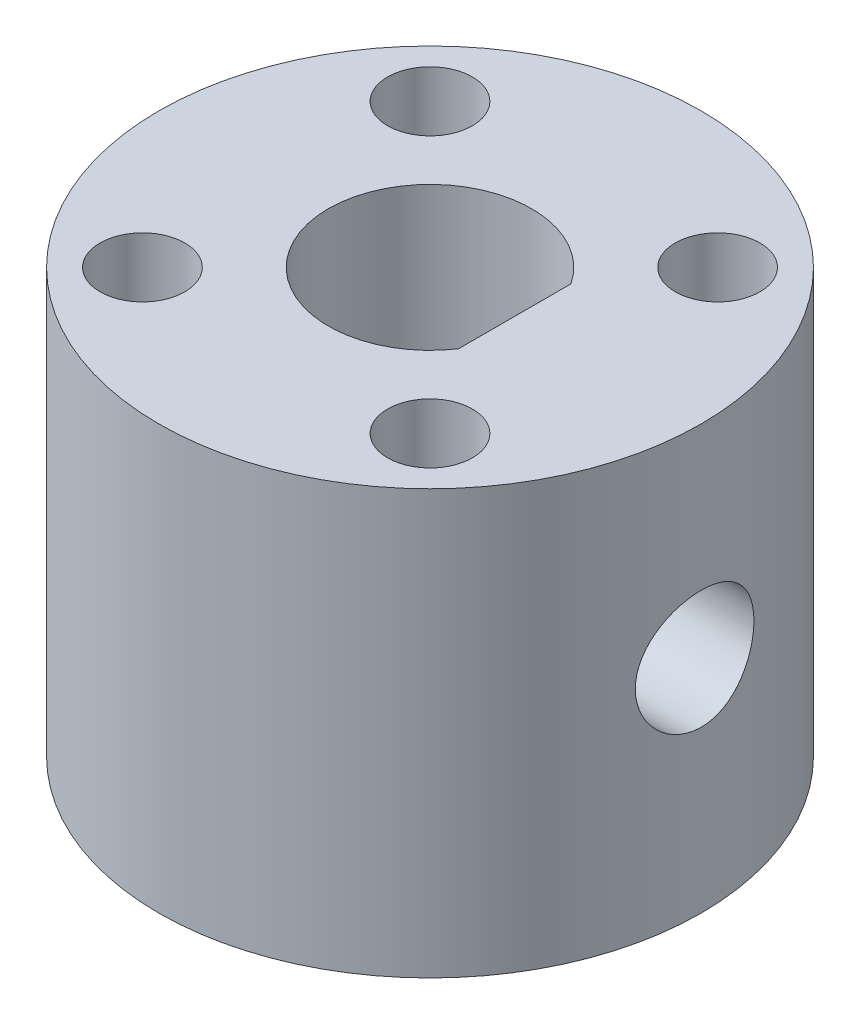
ISO-10303-21;
HEADER;
FILE_DESCRIPTION(('STEP AP214'),'2;1');
FILE_NAME('part.step','',(''),(''),'','','');
FILE_SCHEMA(('AUTOMOTIVE_DESIGN { 1 0 10303 214 1 1 1 1 }'));
ENDSEC;
DATA;
#1=APPLICATION_CONTEXT('core data for automotive mechanical design processes');
#2=APPLICATION_PROTOCOL_DEFINITION('international standard','automotive_design',2000,#1);
#3=PRODUCT_CONTEXT('',#1,'mechanical');
#4=PRODUCT('Part','Part','',(#3));
#5=PRODUCT_RELATED_PRODUCT_CATEGORY('part','',(#4));
#6=PRODUCT_DEFINITION_FORMATION('','',#4);
#7=PRODUCT_DEFINITION_CONTEXT('part definition',#1,'design');
#8=PRODUCT_DEFINITION('design','',#6,#7);
#9=PRODUCT_DEFINITION_SHAPE('','',#8);
#10=(LENGTH_UNIT() NAMED_UNIT(*) SI_UNIT(.MILLI.,.METRE.));
#11=(NAMED_UNIT(*) PLANE_ANGLE_UNIT() SI_UNIT($,.RADIAN.));
#12=(NAMED_UNIT(*) SI_UNIT($,.STERADIAN.) SOLID_ANGLE_UNIT());
#13=UNCERTAINTY_MEASURE_WITH_UNIT(LENGTH_MEASURE(1.E-05),#10,'distance_accuracy_value','');
#14=(GEOMETRIC_REPRESENTATION_CONTEXT(3) GLOBAL_UNCERTAINTY_ASSIGNED_CONTEXT((#13)) GLOBAL_UNIT_ASSIGNED_CONTEXT((#10,
#11,#12)) REPRESENTATION_CONTEXT('',''));
#15=CARTESIAN_POINT('',(0.,0.,0.));
#16=DIRECTION('',(0.,0.,1.));
#17=DIRECTION('',(1.,0.,0.));
#18=AXIS2_PLACEMENT_3D('',#15,#16,#17);
#19=CARTESIAN_POINT('',(2.5,12.5,-1.6583123951777));
#20=DIRECTION('',(-1.,0.,0.));
#21=DIRECTION('',(0.,0.,1.));
#22=AXIS2_PLACEMENT_3D('',#19,#20,#21);
#23=PLANE('',#22);
#24=CARTESIAN_POINT('',(2.5,6.5,0.));
#25=DIRECTION('',(-1.,0.,0.));
#26=DIRECTION('',(0.,0.,1.));
#27=AXIS2_PLACEMENT_3D('',#24,#25,#26);
#28=CIRCLE('',#27,1.75);
#29=CARTESIAN_POINT('',(2.5,7.05901699437495,1.6583123951777));
#30=VERTEX_POINT('',#29);
#31=CARTESIAN_POINT('',(2.5,7.05901699437495,-1.6583123951777));
#32=VERTEX_POINT('',#31);
#33=EDGE_CURVE('E99',#30,#32,#28,.T.);
#34=ORIENTED_EDGE('',*,*,#33,.F.);
#35=DIRECTION('',(0.,-1.,0.));
#36=VECTOR('',#35,1.);
#37=CARTESIAN_POINT('',(2.5,12.5,1.6583123951777));
#38=LINE('',#37,#36);
#39=CARTESIAN_POINT('',(2.5,12.5,1.6583123951777));
#40=VERTEX_POINT('',#39);
#41=EDGE_CURVE('E71',#40,#30,#38,.T.);
#42=ORIENTED_EDGE('',*,*,#41,.F.);
#43=DIRECTION('',(0.,0.,-1.));
#44=VECTOR('',#43,1.);
#45=CARTESIAN_POINT('',(2.5,12.5,-1.6583123951777));
#46=LINE('',#45,#44);
#47=CARTESIAN_POINT('',(2.5,12.5,-1.6583123951777));
#48=VERTEX_POINT('',#47);
#49=EDGE_CURVE('E123',#40,#48,#46,.T.);
#50=ORIENTED_EDGE('',*,*,#49,.T.);
#51=DIRECTION('',(0.,-1.,0.));
#52=VECTOR('',#51,1.);
#53=CARTESIAN_POINT('',(2.5,12.5,-1.6583123951777));
#54=LINE('',#53,#52);
#55=EDGE_CURVE('E106',#48,#32,#54,.T.);
#56=ORIENTED_EDGE('',*,*,#55,.T.);
#57=EDGE_LOOP('',(#34,#42,#50,#56));
#58=FACE_BOUND('',#57,.T.);
#59=ADVANCED_FACE('F48',(#58),#23,.T.);
#60=CARTESIAN_POINT('',(0.,12.5,0.));
#61=DIRECTION('',(0.,1.,0.));
#62=DIRECTION('',(0.,0.,1.));
#63=AXIS2_PLACEMENT_3D('',#60,#61,#62);
#64=PLANE('',#63);
#65=CARTESIAN_POINT('',(-4.24264068711904,12.5,4.24264068711953));
#66=DIRECTION('',(0.,1.,0.));
#67=DIRECTION('',(0.,0.,1.));
#68=AXIS2_PLACEMENT_3D('',#65,#66,#67);
#69=CIRCLE('',#68,1.25000000000018);
#70=CARTESIAN_POINT('',(-4.24264068711904,12.5,5.49264068711971));
#71=VERTEX_POINT('',#70);
#72=EDGE_CURVE('E133',#71,#71,#69,.T.);
#73=ORIENTED_EDGE('',*,*,#72,.F.);
#74=EDGE_LOOP('',(#73));
#75=FACE_BOUND('',#74,.T.);
#76=CARTESIAN_POINT('',(4.24264068711928,12.5,-4.24264068711929));
#77=DIRECTION('',(0.,1.,0.));
#78=DIRECTION('',(0.,0.,1.));
#79=AXIS2_PLACEMENT_3D('',#76,#77,#78);
#80=CIRCLE('',#79,1.25);
#81=CARTESIAN_POINT('',(4.24264068711928,12.5,-2.99264068711929));
#82=VERTEX_POINT('',#81);
#83=EDGE_CURVE('E283',#82,#82,#80,.T.);
#84=ORIENTED_EDGE('',*,*,#83,.F.);
#85=EDGE_LOOP('',(#84));
#86=FACE_BOUND('',#85,.T.);
#87=CARTESIAN_POINT('',(0.,12.5,0.));
#88=DIRECTION('',(0.,1.,0.));
#89=DIRECTION('',(0.,0.,1.));
#90=AXIS2_PLACEMENT_3D('',#87,#88,#89);
#91=CIRCLE('',#90,8.);
#92=CARTESIAN_POINT('',(0.,12.5,8.));
#93=VERTEX_POINT('',#92);
#94=EDGE_CURVE('E57',#93,#93,#91,.T.);
#95=ORIENTED_EDGE('',*,*,#94,.T.);
#96=EDGE_LOOP('',(#95));
#97=FACE_BOUND('',#96,.T.);
#98=CARTESIAN_POINT('',(4.24264068711953,12.5,4.24264068711928));
#99=DIRECTION('',(0.,1.,0.));
#100=DIRECTION('',(0.,0.,1.));
#101=AXIS2_PLACEMENT_3D('',#98,#99,#100);
#102=CIRCLE('',#101,1.24999999999994);
#103=CARTESIAN_POINT('',(4.24264068711953,12.5,5.49264068711922));
#104=VERTEX_POINT('',#103);
#105=EDGE_CURVE('E115',#104,#104,#102,.T.);
#106=ORIENTED_EDGE('',*,*,#105,.F.);
#107=EDGE_LOOP('',(#106));
#108=FACE_BOUND('',#107,.T.);
#109=ORIENTED_EDGE('',*,*,#49,.F.);
#110=CARTESIAN_POINT('',(0.,12.5,0.));
#111=DIRECTION('',(0.,1.,0.));
#112=DIRECTION('',(0.,0.,1.));
#113=AXIS2_PLACEMENT_3D('',#110,#111,#112);
#114=CIRCLE('',#113,3.);
#115=EDGE_CURVE('E111',#48,#40,#114,.T.);
#116=ORIENTED_EDGE('',*,*,#115,.F.);
#117=EDGE_LOOP('',(#109,#116));
#118=FACE_BOUND('',#117,.T.);
#119=CARTESIAN_POINT('',(-4.24264068711929,12.5,-4.24264068711904));
#120=DIRECTION('',(0.,1.,0.));
#121=DIRECTION('',(0.,0.,1.));
#122=AXIS2_PLACEMENT_3D('',#119,#120,#121);
#123=CIRCLE('',#122,1.25000000000026);
#124=CARTESIAN_POINT('',(-4.24264068711929,12.5,-2.99264068711878));
#125=VERTEX_POINT('',#124);
#126=EDGE_CURVE('E149',#125,#125,#123,.T.);
#127=ORIENTED_EDGE('',*,*,#126,.F.);
#128=EDGE_LOOP('',(#127));
#129=FACE_BOUND('',#128,.T.);
#130=ADVANCED_FACE('F175',(#75,#86,#97,#108,#118,#129),#64,.T.);
#131=CARTESIAN_POINT('',(0.,0.,0.));
#132=DIRECTION('',(0.,1.,0.));
#133=DIRECTION('',(0.,0.,1.));
#134=AXIS2_PLACEMENT_3D('',#131,#132,#133);
#135=PLANE('',#134);
#136=CARTESIAN_POINT('',(4.24264068711953,0.,4.24264068711928));
#137=DIRECTION('',(0.,1.,0.));
#138=DIRECTION('',(0.,0.,1.));
#139=AXIS2_PLACEMENT_3D('',#136,#137,#138);
#140=CIRCLE('',#139,1.24999999999994);
#141=CARTESIAN_POINT('',(4.24264068711953,0.,5.49264068711922));
#142=VERTEX_POINT('',#141);
#143=EDGE_CURVE('E113',#142,#142,#140,.T.);
#144=ORIENTED_EDGE('',*,*,#143,.T.);
#145=EDGE_LOOP('',(#144));
#146=FACE_BOUND('',#145,.T.);
#147=CARTESIAN_POINT('',(4.24264068711928,0.,-4.24264068711929));
#148=DIRECTION('',(0.,1.,0.));
#149=DIRECTION('',(0.,0.,1.));
#150=AXIS2_PLACEMENT_3D('',#147,#148,#149);
#151=CIRCLE('',#150,1.25);
#152=CARTESIAN_POINT('',(4.24264068711928,0.,-2.99264068711929));
#153=VERTEX_POINT('',#152);
#154=EDGE_CURVE('E278',#153,#153,#151,.T.);
#155=ORIENTED_EDGE('',*,*,#154,.T.);
#156=EDGE_LOOP('',(#155));
#157=FACE_BOUND('',#156,.T.);
#158=CARTESIAN_POINT('',(0.,0.,0.));
#159=DIRECTION('',(0.,1.,0.));
#160=DIRECTION('',(0.,0.,1.));
#161=AXIS2_PLACEMENT_3D('',#158,#159,#160);
#162=CIRCLE('',#161,8.);
#163=CARTESIAN_POINT('',(0.,0.,8.));
#164=VERTEX_POINT('',#163);
#165=EDGE_CURVE('E281',#164,#164,#162,.T.);
#166=ORIENTED_EDGE('',*,*,#165,.F.);
#167=EDGE_LOOP('',(#166));
#168=FACE_BOUND('',#167,.T.);
#169=CARTESIAN_POINT('',(0.,0.,0.));
#170=DIRECTION('',(0.,1.,0.));
#171=DIRECTION('',(0.,0.,1.));
#172=AXIS2_PLACEMENT_3D('',#169,#170,#171);
#173=CIRCLE('',#172,3.);
#174=CARTESIAN_POINT('',(2.5,0.,-1.6583123951777));
#175=VERTEX_POINT('',#174);
#176=CARTESIAN_POINT('',(2.5,0.,1.6583123951777));
#177=VERTEX_POINT('',#176);
#178=EDGE_CURVE('E131',#175,#177,#173,.T.);
#179=ORIENTED_EDGE('',*,*,#178,.T.);
#180=DIRECTION('',(0.,0.,-1.));
#181=VECTOR('',#180,1.);
#182=CARTESIAN_POINT('',(2.5,0.,-1.6583123951777));
#183=LINE('',#182,#181);
#184=EDGE_CURVE('E127',#177,#175,#183,.T.);
#185=ORIENTED_EDGE('',*,*,#184,.T.);
#186=EDGE_LOOP('',(#179,#185));
#187=FACE_BOUND('',#186,.T.);
#188=CARTESIAN_POINT('',(-4.24264068711904,0.,4.24264068711953));
#189=DIRECTION('',(0.,1.,0.));
#190=DIRECTION('',(0.,0.,1.));
#191=AXIS2_PLACEMENT_3D('',#188,#189,#190);
#192=CIRCLE('',#191,1.25000000000018);
#193=CARTESIAN_POINT('',(-4.24264068711904,0.,5.49264068711971));
#194=VERTEX_POINT('',#193);
#195=EDGE_CURVE('E297',#194,#194,#192,.T.);
#196=ORIENTED_EDGE('',*,*,#195,.T.);
#197=EDGE_LOOP('',(#196));
#198=FACE_BOUND('',#197,.T.);
#199=CARTESIAN_POINT('',(-4.24264068711929,0.,-4.24264068711904));
#200=DIRECTION('',(0.,1.,0.));
#201=DIRECTION('',(0.,0.,1.));
#202=AXIS2_PLACEMENT_3D('',#199,#200,#201);
#203=CIRCLE('',#202,1.25000000000026);
#204=CARTESIAN_POINT('',(-4.24264068711929,0.,-2.99264068711878));
#205=VERTEX_POINT('',#204);
#206=EDGE_CURVE('E148',#205,#205,#203,.T.);
#207=ORIENTED_EDGE('',*,*,#206,.T.);
#208=EDGE_LOOP('',(#207));
#209=FACE_BOUND('',#208,.T.);
#210=ADVANCED_FACE('F136',(#146,#157,#168,#187,#198,#209),#135,.F.);
#211=CARTESIAN_POINT('',(0.,12.5,0.));
#212=DIRECTION('',(0.,-1.,0.));
#213=DIRECTION('',(0.,0.,-1.));
#214=AXIS2_PLACEMENT_3D('',#211,#212,#213);
#215=CYLINDRICAL_SURFACE('',#214,8.);
#216=CARTESIAN_POINT('',(7.806247497998,6.5,1.75));
#217=CARTESIAN_POINT('',(7.80624945905135,6.5970280134328,1.74999666332348));
#218=CARTESIAN_POINT('',(7.80807622046454,6.69409613131077,1.74190303951004));
#219=CARTESIAN_POINT('',(7.81517245186505,6.88547190452197,1.70977784205172));
#220=CARTESIAN_POINT('',(7.82044441049014,6.9797775128667,1.68573474711853));
#221=CARTESIAN_POINT('',(7.83380603690741,7.16283224840003,1.62250390010279));
#222=CARTESIAN_POINT('',(7.84189261163066,7.25158734942516,1.58333276753284));
#223=CARTESIAN_POINT('',(7.85996859341366,7.42126808384546,1.49100532370988));
#224=CARTESIAN_POINT('',(7.86995796134536,7.50219387818681,1.43784930002628));
#225=CARTESIAN_POINT('',(7.89090255292062,7.65528746219411,1.31810359988612));
#226=CARTESIAN_POINT('',(7.9018701337505,7.72730370192507,1.25132229635412));
#227=CARTESIAN_POINT('',(7.92342719705843,7.85920661250848,1.10663537787889));
#228=CARTESIAN_POINT('',(7.93401665008983,7.91909234038854,1.02872889891566));
#229=CARTESIAN_POINT('',(7.95375888221752,8.02563376766824,0.862987032725175));
#230=CARTESIAN_POINT('',(7.96289538073787,8.07214370475895,0.775055841165997));
#231=CARTESIAN_POINT('',(7.97856268454442,8.14967026302601,0.592392423905255));
#232=CARTESIAN_POINT('',(7.98509378226925,8.18068862312565,0.497660962897147));
#233=CARTESIAN_POINT('',(7.99472708358188,8.2258748825834,0.305661830671521));
#234=CARTESIAN_POINT('',(7.99788142586321,8.24029926939322,0.208457182926348));
#235=CARTESIAN_POINT('',(8.0005864524206,8.25269005951142,0.0129599543265384));
#236=CARTESIAN_POINT('',(8.0001375490446,8.25065834602135,-0.0853325007561179));
#237=CARTESIAN_POINT('',(7.99572650969379,8.23038562955477,-0.278447020872957));
#238=CARTESIAN_POINT('',(7.99182429717546,8.21242108892483,-0.373299678484486));
#239=CARTESIAN_POINT('',(7.98101337797756,8.1612332198815,-0.558610512900447));
#240=CARTESIAN_POINT('',(7.97410453534111,8.12800920144575,-0.649068490776132));
#241=CARTESIAN_POINT('',(7.95796028660624,8.0470009519331,-0.823789626976182));
#242=CARTESIAN_POINT('',(7.94870822179818,7.99911193007744,-0.908002597477633));
#243=CARTESIAN_POINT('',(7.92889198192016,7.89021121300223,-1.0672978291922));
#244=CARTESIAN_POINT('',(7.91832762815045,7.82919772974151,-1.14237884410839));
#245=CARTESIAN_POINT('',(7.89678896628589,7.69427494914098,-1.2829231189912));
#246=CARTESIAN_POINT('',(7.88581070205046,7.62012369439249,-1.34815369731024));
#247=CARTESIAN_POINT('',(7.86488750618514,7.46182107960562,-1.46529720114584));
#248=CARTESIAN_POINT('',(7.85494260258143,7.37766944847562,-1.51720976551523));
#249=CARTESIAN_POINT('',(7.83720169317003,7.20137855391294,-1.6063470980224));
#250=CARTESIAN_POINT('',(7.82941214351679,7.10921635629231,-1.64352787918374));
#251=CARTESIAN_POINT('',(7.81695337423894,6.91974131726177,-1.7018041084034));
#252=CARTESIAN_POINT('',(7.81228365953274,6.82242929571543,-1.72290210868729));
#253=CARTESIAN_POINT('',(7.80669425421976,6.6275430724976,-1.74805293703087));
#254=CARTESIAN_POINT('',(7.8057000358533,6.5300146817394,-1.75244457285897));
#255=CARTESIAN_POINT('',(7.80737314858982,6.3356192963787,-1.74497530075208));
#256=CARTESIAN_POINT('',(7.81004022809689,6.23875225678935,-1.73311550957759));
#257=CARTESIAN_POINT('',(7.81866504603975,6.04960908479507,-1.69377399635069));
#258=CARTESIAN_POINT('',(7.82458345002008,5.95729217598327,-1.66647889658488));
#259=CARTESIAN_POINT('',(7.83900857622703,5.7785420299274,-1.59724364761113));
#260=CARTESIAN_POINT('',(7.84751554623324,5.69210935689667,-1.55530209637649));
#261=CARTESIAN_POINT('',(7.86632301994175,5.52611502156563,-1.45721807999334));
#262=CARTESIAN_POINT('',(7.87664912166245,5.44667964078173,-1.40086690882525));
#263=CARTESIAN_POINT('',(7.89786385707838,5.29826831630606,-1.27583634037906));
#264=CARTESIAN_POINT('',(7.90875256052719,5.22929367376997,-1.20715541178423));
#265=CARTESIAN_POINT('',(7.93011129182084,5.10244662987705,-1.05788176090421));
#266=CARTESIAN_POINT('',(7.94056972743614,5.04480521977106,-0.977090811057815));
#267=CARTESIAN_POINT('',(7.95967616453578,4.94391275727052,-0.806775937992834));
#268=CARTESIAN_POINT('',(7.96832425057138,4.900661032759,-0.717252422909713));
#269=CARTESIAN_POINT('',(7.98278670652031,4.83009735306519,-0.532571442115365));
#270=CARTESIAN_POINT('',(7.98861898874485,4.80268441612702,-0.437454026381446));
#271=CARTESIAN_POINT('',(7.99687014437095,4.7642611388551,-0.243822113274709));
#272=CARTESIAN_POINT('',(7.99928951409338,4.75324841351692,-0.145308111983489));
#273=CARTESIAN_POINT('',(8.00042750683747,4.74804542172717,0.0501276775760973));
#274=CARTESIAN_POINT('',(7.99922200056368,4.75351027681963,0.147040003201597));
#275=CARTESIAN_POINT('',(7.99340825361615,4.78033588259217,0.338529305331091));
#276=CARTESIAN_POINT('',(7.98880007413318,4.8016963474192,0.433106323799652));
#277=CARTESIAN_POINT('',(7.97670437671938,4.85954154393653,0.616973514243788));
#278=CARTESIAN_POINT('',(7.96922617829729,4.89597735265226,0.706279729669992));
#279=CARTESIAN_POINT('',(7.95218899565129,4.98289125993948,0.877557024231171));
#280=CARTESIAN_POINT('',(7.94262980942251,5.03337072188345,0.959527390172563));
#281=CARTESIAN_POINT('',(7.92224687676354,5.14806349215517,1.11548832576446));
#282=CARTESIAN_POINT('',(7.91140257019292,5.21251931550726,1.18929788040884));
#283=CARTESIAN_POINT('',(7.88978238696403,5.35284600036101,1.32517104073326));
#284=CARTESIAN_POINT('',(7.87900652743123,5.42871960976419,1.38723181070999));
#285=CARTESIAN_POINT('',(7.85858267483524,5.5909483927375,1.4986453367496));
#286=CARTESIAN_POINT('',(7.84895169360709,5.67743017770953,1.54781703198666));
#287=CARTESIAN_POINT('',(7.83212199429224,5.85762202329952,1.63085060859479));
#288=CARTESIAN_POINT('',(7.82492121927565,5.95132588819277,1.66472544549927));
#289=CARTESIAN_POINT('',(7.81509833526494,6.12093736069939,1.71015691938045));
#290=CARTESIAN_POINT('',(7.81180130346357,6.19592505147677,1.72506941603846));
#291=CARTESIAN_POINT('',(7.80737516581754,6.34726692233281,1.74499202826869));
#292=CARTESIAN_POINT('',(7.80624595428687,6.42362103561219,1.7500026265806));
#293=CARTESIAN_POINT('',(7.806247497998,6.5,1.75));
#294=B_SPLINE_CURVE_WITH_KNOTS('',3,(#216,#217,#218,#219,#220,#221,#222,#223,#224,#225,#226,
#227,#228,#229,#230,#231,#232,#233,#234,#235,#236,#237,#238,#239,#240,#241,#242,#243,#244,#245,
#246,#247,#248,#249,#250,#251,#252,#253,#254,#255,#256,#257,#258,#259,#260,#261,#262,#263,#264,
#265,#266,#267,#268,#269,#270,#271,#272,#273,#274,#275,#276,#277,#278,#279,#280,#281,#282,#283,
#284,#285,#286,#287,#288,#289,#290,#291,#292,#293),.UNSPECIFIED.,.T.,.F.,(4,2,2,2,2,2,2,2,2,2,2,
2,2,2,2,2,2,2,2,2,2,2,2,2,2,2,2,2,2,2,2,2,2,2,2,2,2,2,4),(0.,0.290804115870692,
0.581818526599534,0.872514137052688,1.16320377043854,1.45830491896335,1.75342899855111,
2.05165686348641,2.34985124493558,2.64337184515389,2.93685885596571,3.2253508676411,
3.51385592599757,3.8044726414071,4.09512897475707,4.39183436537594,4.68854780096223,
4.98614062158782,5.28368620646371,5.57516431760517,5.86662240004893,6.15462969113393,
6.44266455918165,6.7351342450112,7.02764027980828,7.32560034403598,7.62354648911712,
7.91957146995089,8.21555339708043,8.50538367763981,8.79520874626514,9.08410055231566,
9.37302041407614,9.6674247415535,9.96190003653334,10.2603137141584,10.5584741768494,
10.7874018788084,11.0163184197546),.UNSPECIFIED.);
#295=CARTESIAN_POINT('',(7.806247497998,6.5,1.75));
#296=VERTEX_POINT('',#295);
#297=EDGE_CURVE('E107',#296,#296,#294,.T.);
#298=ORIENTED_EDGE('',*,*,#297,.T.);
#299=EDGE_LOOP('',(#298));
#300=FACE_BOUND('',#299,.T.);
#301=ORIENTED_EDGE('',*,*,#94,.F.);
#302=EDGE_LOOP('',(#301));
#303=FACE_BOUND('',#302,.T.);
#304=ORIENTED_EDGE('',*,*,#165,.T.);
#305=EDGE_LOOP('',(#304));
#306=FACE_BOUND('',#305,.T.);
#307=ADVANCED_FACE('F50',(#300,#303,#306),#215,.T.);
#308=CARTESIAN_POINT('',(4.24264068711928,12.5,-4.24264068711929));
#309=DIRECTION('',(0.,-1.,0.));
#310=DIRECTION('',(0.,0.,-1.));
#311=AXIS2_PLACEMENT_3D('',#308,#309,#310);
#312=CYLINDRICAL_SURFACE('',#311,1.25);
#313=ORIENTED_EDGE('',*,*,#83,.T.);
#314=EDGE_LOOP('',(#313));
#315=FACE_BOUND('',#314,.T.);
#316=ORIENTED_EDGE('',*,*,#154,.F.);
#317=EDGE_LOOP('',(#316));
#318=FACE_BOUND('',#317,.T.);
#319=ADVANCED_FACE('F170',(#315,#318),#312,.F.);
#320=CARTESIAN_POINT('',(4.24264068711953,12.5,4.24264068711928));
#321=DIRECTION('',(0.,-1.,0.));
#322=DIRECTION('',(0.,0.,-1.));
#323=AXIS2_PLACEMENT_3D('',#320,#321,#322);
#324=CYLINDRICAL_SURFACE('',#323,1.24999999999994);
#325=ORIENTED_EDGE('',*,*,#105,.T.);
#326=EDGE_LOOP('',(#325));
#327=FACE_BOUND('',#326,.T.);
#328=ORIENTED_EDGE('',*,*,#143,.F.);
#329=EDGE_LOOP('',(#328));
#330=FACE_BOUND('',#329,.T.);
#331=ADVANCED_FACE('F167',(#327,#330),#324,.F.);
#332=CARTESIAN_POINT('',(0.,12.5,0.));
#333=DIRECTION('',(0.,-1.,0.));
#334=DIRECTION('',(0.,0.,-1.));
#335=AXIS2_PLACEMENT_3D('',#332,#333,#334);
#336=CYLINDRICAL_SURFACE('',#335,3.);
#337=ORIENTED_EDGE('',*,*,#178,.F.);
#338=CARTESIAN_POINT('',(2.5,5.94098300562505,-1.6583123951777));
#339=VERTEX_POINT('',#338);
#340=EDGE_CURVE('E121',#339,#175,#54,.T.);
#341=ORIENTED_EDGE('',*,*,#340,.F.);
#342=EDGE_CURVE('E120',#32,#339,#54,.T.);
#343=ORIENTED_EDGE('',*,*,#342,.F.);
#344=ORIENTED_EDGE('',*,*,#55,.F.);
#345=ORIENTED_EDGE('',*,*,#115,.T.);
#346=ORIENTED_EDGE('',*,*,#41,.T.);
#347=CARTESIAN_POINT('',(2.5,5.94098300562505,1.6583123951777));
#348=VERTEX_POINT('',#347);
#349=EDGE_CURVE('E90',#30,#348,#38,.T.);
#350=ORIENTED_EDGE('',*,*,#349,.T.);
#351=EDGE_CURVE('E95',#348,#177,#38,.T.);
#352=ORIENTED_EDGE('',*,*,#351,.T.);
#353=EDGE_LOOP('',(#337,#341,#343,#344,#345,#346,#350,#352));
#354=FACE_BOUND('',#353,.T.);
#355=ADVANCED_FACE('F109',(#354),#336,.F.);
#356=CARTESIAN_POINT('',(2.5,6.5,0.));
#357=DIRECTION('',(-1.,0.,0.));
#358=DIRECTION('',(0.,0.,1.));
#359=AXIS2_PLACEMENT_3D('',#356,#357,#358);
#360=CIRCLE('',#359,1.75);
#361=EDGE_CURVE('E13',#339,#348,#360,.T.);
#362=ORIENTED_EDGE('',*,*,#361,.F.);
#363=ORIENTED_EDGE('',*,*,#340,.T.);
#364=ORIENTED_EDGE('',*,*,#184,.F.);
#365=ORIENTED_EDGE('',*,*,#351,.F.);
#366=EDGE_LOOP('',(#362,#363,#364,#365));
#367=FACE_BOUND('',#366,.T.);
#368=ADVANCED_FACE('F138',(#367),#23,.T.);
#369=CARTESIAN_POINT('',(-4.24264068711904,12.5,4.24264068711953));
#370=DIRECTION('',(0.,-1.,0.));
#371=DIRECTION('',(0.,0.,-1.));
#372=AXIS2_PLACEMENT_3D('',#369,#370,#371);
#373=CYLINDRICAL_SURFACE('',#372,1.25000000000018);
#374=ORIENTED_EDGE('',*,*,#72,.T.);
#375=EDGE_LOOP('',(#374));
#376=FACE_BOUND('',#375,.T.);
#377=ORIENTED_EDGE('',*,*,#195,.F.);
#378=EDGE_LOOP('',(#377));
#379=FACE_BOUND('',#378,.T.);
#380=ADVANCED_FACE('F158',(#376,#379),#373,.F.);
#381=CARTESIAN_POINT('',(-4.24264068711929,12.5,-4.24264068711904));
#382=DIRECTION('',(0.,-1.,0.));
#383=DIRECTION('',(0.,0.,-1.));
#384=AXIS2_PLACEMENT_3D('',#381,#382,#383);
#385=CYLINDRICAL_SURFACE('',#384,1.25000000000026);
#386=ORIENTED_EDGE('',*,*,#126,.T.);
#387=EDGE_LOOP('',(#386));
#388=FACE_BOUND('',#387,.T.);
#389=ORIENTED_EDGE('',*,*,#206,.F.);
#390=EDGE_LOOP('',(#389));
#391=FACE_BOUND('',#390,.T.);
#392=ADVANCED_FACE('F155',(#388,#391),#385,.F.);
#393=CARTESIAN_POINT('',(2.5,6.5,0.));
#394=DIRECTION('',(-1.,0.,0.));
#395=DIRECTION('',(0.,0.,1.));
#396=AXIS2_PLACEMENT_3D('',#393,#394,#395);
#397=PLANE('',#396);
#398=ORIENTED_EDGE('',*,*,#342,.T.);
#399=EDGE_CURVE('E63',#32,#339,#28,.T.);
#400=ORIENTED_EDGE('',*,*,#399,.F.);
#401=EDGE_LOOP('',(#398,#400));
#402=FACE_BOUND('',#401,.T.);
#403=ADVANCED_FACE('F140',(#402),#397,.F.);
#404=CARTESIAN_POINT('',(12.5,6.5,0.));
#405=DIRECTION('',(-1.,0.,0.));
#406=DIRECTION('',(0.,0.,1.));
#407=AXIS2_PLACEMENT_3D('',#404,#405,#406);
#408=CYLINDRICAL_SURFACE('',#407,1.75);
#409=ORIENTED_EDGE('',*,*,#33,.T.);
#410=ORIENTED_EDGE('',*,*,#399,.T.);
#411=ORIENTED_EDGE('',*,*,#361,.T.);
#412=EDGE_CURVE('E93',#348,#30,#28,.T.);
#413=ORIENTED_EDGE('',*,*,#412,.T.);
#414=EDGE_LOOP('',(#409,#410,#411,#413));
#415=FACE_BOUND('',#414,.T.);
#416=ORIENTED_EDGE('',*,*,#297,.F.);
#417=EDGE_LOOP('',(#416));
#418=FACE_BOUND('',#417,.T.);
#419=ADVANCED_FACE('F97',(#415,#418),#408,.F.);
#420=ORIENTED_EDGE('',*,*,#349,.F.);
#421=ORIENTED_EDGE('',*,*,#412,.F.);
#422=EDGE_LOOP('',(#420,#421));
#423=FACE_BOUND('',#422,.T.);
#424=ADVANCED_FACE('F92',(#423),#397,.F.);
#425=CLOSED_SHELL('',(#59,#130,#210,#307,#319,#331,#355,#368,#380,#392,#403,#419,#424));
#426=MANIFOLD_SOLID_BREP('B2',#425);
#427=ADVANCED_BREP_SHAPE_REPRESENTATION('',(#18,#426),#14);
#428=SHAPE_DEFINITION_REPRESENTATION(#9,#427);
ENDSEC;
END-ISO-10303-21;
